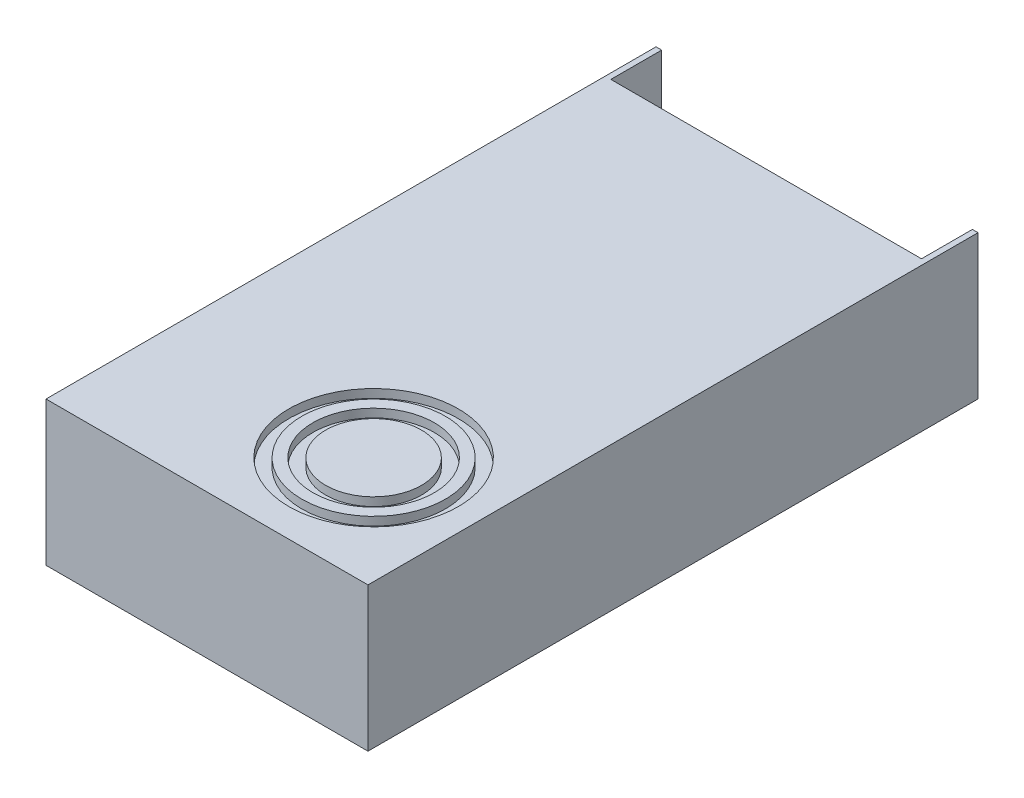
ISO-10303-21;
HEADER;
FILE_DESCRIPTION(('STEP AP214'),'2;1');
FILE_NAME('part.step','',(''),(''),'','','');
FILE_SCHEMA(('AUTOMOTIVE_DESIGN { 1 0 10303 214 1 1 1 1 }'));
ENDSEC;
DATA;
#1=APPLICATION_CONTEXT('core data for automotive mechanical design processes');
#2=APPLICATION_PROTOCOL_DEFINITION('international standard','automotive_design',2000,#1);
#3=PRODUCT_CONTEXT('',#1,'mechanical');
#4=PRODUCT('Part','Part','',(#3));
#5=PRODUCT_RELATED_PRODUCT_CATEGORY('part','',(#4));
#6=PRODUCT_DEFINITION_FORMATION('','',#4);
#7=PRODUCT_DEFINITION_CONTEXT('part definition',#1,'design');
#8=PRODUCT_DEFINITION('design','',#6,#7);
#9=PRODUCT_DEFINITION_SHAPE('','',#8);
#10=(LENGTH_UNIT() NAMED_UNIT(*) SI_UNIT(.MILLI.,.METRE.));
#11=(NAMED_UNIT(*) PLANE_ANGLE_UNIT() SI_UNIT($,.RADIAN.));
#12=(NAMED_UNIT(*) SI_UNIT($,.STERADIAN.) SOLID_ANGLE_UNIT());
#13=UNCERTAINTY_MEASURE_WITH_UNIT(LENGTH_MEASURE(1.E-05),#10,'distance_accuracy_value','');
#14=(GEOMETRIC_REPRESENTATION_CONTEXT(3) GLOBAL_UNCERTAINTY_ASSIGNED_CONTEXT((#13)) GLOBAL_UNIT_ASSIGNED_CONTEXT((#10,
#11,#12)) REPRESENTATION_CONTEXT('',''));
#15=CARTESIAN_POINT('',(0.,0.,0.));
#16=DIRECTION('',(0.,0.,1.));
#17=DIRECTION('',(1.,0.,0.));
#18=AXIS2_PLACEMENT_3D('',#15,#16,#17);
#19=CARTESIAN_POINT('',(-9.40496415424985,8.99999999999999,-27.4856805681259));
#20=DIRECTION('',(0.,0.,1.));
#21=DIRECTION('',(1.,0.,0.));
#22=AXIS2_PLACEMENT_3D('',#19,#20,#21);
#23=PLANE('',#22);
#24=DIRECTION('',(0.,-1.,0.));
#25=VECTOR('',#24,1.);
#26=CARTESIAN_POINT('',(-7.61932535690543,26.,-27.4856805681259));
#27=LINE('',#26,#25);
#28=CARTESIAN_POINT('',(-7.61932535690543,26.,-27.4856805681259));
#29=VERTEX_POINT('',#28);
#30=CARTESIAN_POINT('',(-7.61932535690543,8.99999999999999,-27.4856805681259));
#31=VERTEX_POINT('',#30);
#32=EDGE_CURVE('E137',#29,#31,#27,.T.);
#33=ORIENTED_EDGE('',*,*,#32,.T.);
#34=DIRECTION('',(1.,0.,0.));
#35=VECTOR('',#34,1.);
#36=CARTESIAN_POINT('',(-9.40496415424985,8.99999999999999,-27.4856805681259));
#37=LINE('',#36,#35);
#38=CARTESIAN_POINT('',(-9.40496415424985,8.99999999999999,-27.4856805681259));
#39=VERTEX_POINT('',#38);
#40=EDGE_CURVE('E168',#39,#31,#37,.T.);
#41=ORIENTED_EDGE('',*,*,#40,.F.);
#42=DIRECTION('',(0.,1.,0.));
#43=VECTOR('',#42,1.);
#44=CARTESIAN_POINT('',(-9.40496415424985,8.99999999999999,-27.4856805681259));
#45=LINE('',#44,#43);
#46=CARTESIAN_POINT('',(-9.40496415424985,51.,-27.4856805681259));
#47=VERTEX_POINT('',#46);
#48=EDGE_CURVE('E176',#39,#47,#45,.T.);
#49=ORIENTED_EDGE('',*,*,#48,.T.);
#50=DIRECTION('',(1.,0.,0.));
#51=VECTOR('',#50,1.);
#52=CARTESIAN_POINT('',(-9.40496415424985,51.,-27.4856805681259));
#53=LINE('',#52,#51);
#54=CARTESIAN_POINT('',(100.59503584575,51.,-27.4856805681259));
#55=VERTEX_POINT('',#54);
#56=EDGE_CURVE('E178',#47,#55,#53,.T.);
#57=ORIENTED_EDGE('',*,*,#56,.T.);
#58=DIRECTION('',(0.,1.,0.));
#59=VECTOR('',#58,1.);
#60=CARTESIAN_POINT('',(100.59503584575,8.99999999999999,-27.4856805681259));
#61=LINE('',#60,#59);
#62=CARTESIAN_POINT('',(100.59503584575,8.99999999999999,-27.4856805681259));
#63=VERTEX_POINT('',#62);
#64=EDGE_CURVE('E188',#63,#55,#61,.T.);
#65=ORIENTED_EDGE('',*,*,#64,.F.);
#66=CARTESIAN_POINT('',(79.3806746430946,8.99999999999999,-27.4856805681259));
#67=VERTEX_POINT('',#66);
#68=EDGE_CURVE('E166',#67,#63,#37,.T.);
#69=ORIENTED_EDGE('',*,*,#68,.F.);
#70=DIRECTION('',(0.,-1.,0.));
#71=VECTOR('',#70,1.);
#72=CARTESIAN_POINT('',(79.3806746430946,26.,-27.4856805681259));
#73=LINE('',#72,#71);
#74=CARTESIAN_POINT('',(79.3806746430946,26.,-27.4856805681259));
#75=VERTEX_POINT('',#74);
#76=EDGE_CURVE('E144',#75,#67,#73,.T.);
#77=ORIENTED_EDGE('',*,*,#76,.F.);
#78=DIRECTION('',(1.,0.,0.));
#79=VECTOR('',#78,1.);
#80=CARTESIAN_POINT('',(-7.61932535690543,26.,-27.4856805681259));
#81=LINE('',#80,#79);
#82=EDGE_CURVE('E128',#29,#75,#81,.T.);
#83=ORIENTED_EDGE('',*,*,#82,.F.);
#84=EDGE_LOOP('',(#33,#41,#49,#57,#65,#69,#77,#83));
#85=FACE_BOUND('',#84,.T.);
#86=ADVANCED_FACE('F35',(#85),#23,.F.);
#87=CARTESIAN_POINT('',(0.,8.99999999999999,0.));
#88=DIRECTION('',(0.,1.,0.));
#89=DIRECTION('',(0.,0.,1.));
#90=AXIS2_PLACEMENT_3D('',#87,#88,#89);
#91=PLANE('',#90);
#92=ORIENTED_EDGE('',*,*,#40,.T.);
#93=DIRECTION('',(0.,0.,1.));
#94=VECTOR('',#93,1.);
#95=CARTESIAN_POINT('',(-7.61932535690543,8.99999999999999,-27.4856805681259));
#96=LINE('',#95,#94);
#97=CARTESIAN_POINT('',(-7.61932535690543,8.99999999999999,-43.4856805681259));
#98=VERTEX_POINT('',#97);
#99=EDGE_CURVE('E140',#98,#31,#96,.T.);
#100=ORIENTED_EDGE('',*,*,#99,.F.);
#101=DIRECTION('',(-1.,0.,0.));
#102=VECTOR('',#101,1.);
#103=CARTESIAN_POINT('',(-7.61932535690543,8.99999999999999,-43.4856805681259));
#104=LINE('',#103,#102);
#105=CARTESIAN_POINT('',(79.3806746430946,8.99999999999999,-43.4856805681259));
#106=VERTEX_POINT('',#105);
#107=EDGE_CURVE('E134',#106,#98,#104,.T.);
#108=ORIENTED_EDGE('',*,*,#107,.F.);
#109=DIRECTION('',(0.,0.,-1.));
#110=VECTOR('',#109,1.);
#111=CARTESIAN_POINT('',(79.3806746430946,8.99999999999999,-27.4856805681259));
#112=LINE('',#111,#110);
#113=EDGE_CURVE('E156',#67,#106,#112,.T.);
#114=ORIENTED_EDGE('',*,*,#113,.F.);
#115=ORIENTED_EDGE('',*,*,#68,.T.);
#116=DIRECTION('',(0.,0.,-1.));
#117=VECTOR('',#116,1.);
#118=CARTESIAN_POINT('',(100.59503584575,8.99999999999999,-45.4856805681259));
#119=LINE('',#118,#117);
#120=CARTESIAN_POINT('',(100.59503584575,8.99999999999999,-45.4856805681259));
#121=VERTEX_POINT('',#120);
#122=EDGE_CURVE('E170',#63,#121,#119,.T.);
#123=ORIENTED_EDGE('',*,*,#122,.T.);
#124=DIRECTION('',(-1.,0.,0.));
#125=VECTOR('',#124,1.);
#126=CARTESIAN_POINT('',(-9.40496415424985,8.99999999999999,-45.4856805681259));
#127=LINE('',#126,#125);
#128=CARTESIAN_POINT('',(-9.40496415424985,8.99999999999999,-45.4856805681259));
#129=VERTEX_POINT('',#128);
#130=EDGE_CURVE('E173',#121,#129,#127,.T.);
#131=ORIENTED_EDGE('',*,*,#130,.T.);
#132=DIRECTION('',(0.,0.,1.));
#133=VECTOR('',#132,1.);
#134=CARTESIAN_POINT('',(-9.40496415424985,8.99999999999999,-45.4856805681259));
#135=LINE('',#134,#133);
#136=EDGE_CURVE('E163',#129,#39,#135,.T.);
#137=ORIENTED_EDGE('',*,*,#136,.T.);
#138=EDGE_LOOP('',(#92,#100,#108,#114,#115,#123,#131,#137));
#139=FACE_BOUND('',#138,.T.);
#140=ADVANCED_FACE('F290',(#139),#91,.T.);
#141=CARTESIAN_POINT('',(-11.4049641542499,51.,-45.4856805681259));
#142=DIRECTION('',(1.,0.,0.));
#143=DIRECTION('',(0.,0.,-1.));
#144=AXIS2_PLACEMENT_3D('',#141,#142,#143);
#145=PLANE('',#144);
#146=DIRECTION('',(0.,0.,1.));
#147=VECTOR('',#146,1.);
#148=CARTESIAN_POINT('',(-11.4049641542499,0.,-45.4856805681259));
#149=LINE('',#148,#147);
#150=CARTESIAN_POINT('',(-11.4049641542499,0.,-45.4856805681259));
#151=VERTEX_POINT('',#150);
#152=CARTESIAN_POINT('',(-11.4049641542498,0.,170.514319431874));
#153=VERTEX_POINT('',#152);
#154=EDGE_CURVE('E236',#151,#153,#149,.T.);
#155=ORIENTED_EDGE('',*,*,#154,.T.);
#156=DIRECTION('',(0.,-1.,0.));
#157=VECTOR('',#156,1.);
#158=CARTESIAN_POINT('',(-11.4049641542498,51.,170.514319431874));
#159=LINE('',#158,#157);
#160=CARTESIAN_POINT('',(-11.4049641542498,51.,170.514319431874));
#161=VERTEX_POINT('',#160);
#162=EDGE_CURVE('E11',#161,#153,#159,.T.);
#163=ORIENTED_EDGE('',*,*,#162,.F.);
#164=DIRECTION('',(0.,0.,1.));
#165=VECTOR('',#164,1.);
#166=CARTESIAN_POINT('',(-11.4049641542499,51.,-45.4856805681259));
#167=LINE('',#166,#165);
#168=CARTESIAN_POINT('',(-11.4049641542499,51.,-45.4856805681259));
#169=VERTEX_POINT('',#168);
#170=EDGE_CURVE('E239',#169,#161,#167,.T.);
#171=ORIENTED_EDGE('',*,*,#170,.F.);
#172=DIRECTION('',(0.,-1.,0.));
#173=VECTOR('',#172,1.);
#174=CARTESIAN_POINT('',(-11.4049641542499,51.,-45.4856805681259));
#175=LINE('',#174,#173);
#176=EDGE_CURVE('E251',#169,#151,#175,.T.);
#177=ORIENTED_EDGE('',*,*,#176,.T.);
#178=EDGE_LOOP('',(#155,#163,#171,#177));
#179=FACE_BOUND('',#178,.T.);
#180=ADVANCED_FACE('F37',(#179),#145,.F.);
#181=CARTESIAN_POINT('',(-11.4049641542498,51.,170.514319431874));
#182=DIRECTION('',(0.,0.,-1.));
#183=DIRECTION('',(-1.,0.,0.));
#184=AXIS2_PLACEMENT_3D('',#181,#182,#183);
#185=PLANE('',#184);
#186=DIRECTION('',(1.,0.,0.));
#187=VECTOR('',#186,1.);
#188=CARTESIAN_POINT('',(-11.4049641542498,0.,170.514319431874));
#189=LINE('',#188,#187);
#190=CARTESIAN_POINT('',(102.59503584575,0.,170.514319431874));
#191=VERTEX_POINT('',#190);
#192=EDGE_CURVE('E254',#153,#191,#189,.T.);
#193=ORIENTED_EDGE('',*,*,#192,.T.);
#194=DIRECTION('',(0.,-1.,0.));
#195=VECTOR('',#194,1.);
#196=CARTESIAN_POINT('',(102.59503584575,51.,170.514319431874));
#197=LINE('',#196,#195);
#198=CARTESIAN_POINT('',(102.59503584575,51.,170.514319431874));
#199=VERTEX_POINT('',#198);
#200=EDGE_CURVE('E43',#199,#191,#197,.T.);
#201=ORIENTED_EDGE('',*,*,#200,.F.);
#202=DIRECTION('',(1.,0.,0.));
#203=VECTOR('',#202,1.);
#204=CARTESIAN_POINT('',(-11.4049641542498,51.,170.514319431874));
#205=LINE('',#204,#203);
#206=EDGE_CURVE('E242',#161,#199,#205,.T.);
#207=ORIENTED_EDGE('',*,*,#206,.F.);
#208=ORIENTED_EDGE('',*,*,#162,.T.);
#209=EDGE_LOOP('',(#193,#201,#207,#208));
#210=FACE_BOUND('',#209,.T.);
#211=ADVANCED_FACE('F395',(#210),#185,.F.);
#212=CARTESIAN_POINT('',(102.59503584575,51.,-45.4856805681259));
#213=DIRECTION('',(-1.,0.,0.));
#214=DIRECTION('',(0.,0.,1.));
#215=AXIS2_PLACEMENT_3D('',#212,#213,#214);
#216=PLANE('',#215);
#217=DIRECTION('',(0.,0.,-1.));
#218=VECTOR('',#217,1.);
#219=CARTESIAN_POINT('',(102.59503584575,0.,-45.4856805681259));
#220=LINE('',#219,#218);
#221=CARTESIAN_POINT('',(102.59503584575,0.,-45.4856805681259));
#222=VERTEX_POINT('',#221);
#223=EDGE_CURVE('E256',#191,#222,#220,.T.);
#224=ORIENTED_EDGE('',*,*,#223,.T.);
#225=DIRECTION('',(0.,-1.,0.));
#226=VECTOR('',#225,1.);
#227=CARTESIAN_POINT('',(102.59503584575,51.,-45.4856805681259));
#228=LINE('',#227,#226);
#229=CARTESIAN_POINT('',(102.59503584575,51.,-45.4856805681259));
#230=VERTEX_POINT('',#229);
#231=EDGE_CURVE('E261',#230,#222,#228,.T.);
#232=ORIENTED_EDGE('',*,*,#231,.F.);
#233=DIRECTION('',(0.,0.,-1.));
#234=VECTOR('',#233,1.);
#235=CARTESIAN_POINT('',(102.59503584575,51.,-45.4856805681259));
#236=LINE('',#235,#234);
#237=EDGE_CURVE('E245',#199,#230,#236,.T.);
#238=ORIENTED_EDGE('',*,*,#237,.F.);
#239=ORIENTED_EDGE('',*,*,#200,.T.);
#240=EDGE_LOOP('',(#224,#232,#238,#239));
#241=FACE_BOUND('',#240,.T.);
#242=ADVANCED_FACE('F268',(#241),#216,.F.);
#243=CARTESIAN_POINT('',(-11.4049641542499,51.,-45.4856805681259));
#244=DIRECTION('',(0.,0.,1.));
#245=DIRECTION('',(1.,0.,0.));
#246=AXIS2_PLACEMENT_3D('',#243,#244,#245);
#247=PLANE('',#246);
#248=DIRECTION('',(-1.,0.,0.));
#249=VECTOR('',#248,1.);
#250=CARTESIAN_POINT('',(-11.4049641542499,51.,-45.4856805681259));
#251=LINE('',#250,#249);
#252=CARTESIAN_POINT('',(-9.40496415424985,51.,-45.4856805681259));
#253=VERTEX_POINT('',#252);
#254=EDGE_CURVE('E247',#253,#169,#251,.T.);
#255=ORIENTED_EDGE('',*,*,#254,.F.);
#256=DIRECTION('',(0.,1.,0.));
#257=VECTOR('',#256,1.);
#258=CARTESIAN_POINT('',(-9.40496415424985,8.99999999999999,-45.4856805681259));
#259=LINE('',#258,#257);
#260=EDGE_CURVE('E182',#129,#253,#259,.T.);
#261=ORIENTED_EDGE('',*,*,#260,.F.);
#262=ORIENTED_EDGE('',*,*,#130,.F.);
#263=DIRECTION('',(0.,1.,0.));
#264=VECTOR('',#263,1.);
#265=CARTESIAN_POINT('',(100.59503584575,8.99999999999999,-45.4856805681259));
#266=LINE('',#265,#264);
#267=CARTESIAN_POINT('',(100.59503584575,51.,-45.4856805681259));
#268=VERTEX_POINT('',#267);
#269=EDGE_CURVE('E185',#121,#268,#266,.T.);
#270=ORIENTED_EDGE('',*,*,#269,.T.);
#271=EDGE_CURVE('E248',#230,#268,#251,.T.);
#272=ORIENTED_EDGE('',*,*,#271,.F.);
#273=ORIENTED_EDGE('',*,*,#231,.T.);
#274=DIRECTION('',(-1.,0.,0.));
#275=VECTOR('',#274,1.);
#276=CARTESIAN_POINT('',(-11.4049641542499,0.,-45.4856805681259));
#277=LINE('',#276,#275);
#278=EDGE_CURVE('E243',#222,#151,#277,.T.);
#279=ORIENTED_EDGE('',*,*,#278,.T.);
#280=ORIENTED_EDGE('',*,*,#176,.F.);
#281=EDGE_LOOP('',(#255,#261,#262,#270,#272,#273,#279,#280));
#282=FACE_BOUND('',#281,.T.);
#283=ADVANCED_FACE('F278',(#282),#247,.F.);
#284=CARTESIAN_POINT('',(0.,51.,0.));
#285=DIRECTION('',(0.,1.,0.));
#286=DIRECTION('',(0.,0.,1.));
#287=AXIS2_PLACEMENT_3D('',#284,#285,#286);
#288=PLANE('',#287);
#289=CARTESIAN_POINT('',(64.5950358457502,51.,130.514319431874));
#290=DIRECTION('',(0.,1.,0.));
#291=DIRECTION('',(0.,0.,1.));
#292=AXIS2_PLACEMENT_3D('',#289,#290,#291);
#293=CIRCLE('',#292,30.);
#294=CARTESIAN_POINT('',(64.5950358457502,51.,160.514319431874));
#295=VERTEX_POINT('',#294);
#296=EDGE_CURVE('E545',#295,#295,#293,.T.);
#297=ORIENTED_EDGE('',*,*,#296,.F.);
#298=EDGE_LOOP('',(#297));
#299=FACE_BOUND('',#298,.T.);
#300=DIRECTION('',(0.,0.,1.));
#301=VECTOR('',#300,1.);
#302=CARTESIAN_POINT('',(-9.40496415424985,51.,-45.4856805681259));
#303=LINE('',#302,#301);
#304=EDGE_CURVE('E58',#253,#47,#303,.T.);
#305=ORIENTED_EDGE('',*,*,#304,.F.);
#306=ORIENTED_EDGE('',*,*,#254,.T.);
#307=ORIENTED_EDGE('',*,*,#170,.T.);
#308=ORIENTED_EDGE('',*,*,#206,.T.);
#309=ORIENTED_EDGE('',*,*,#237,.T.);
#310=ORIENTED_EDGE('',*,*,#271,.T.);
#311=DIRECTION('',(0.,0.,-1.));
#312=VECTOR('',#311,1.);
#313=CARTESIAN_POINT('',(100.59503584575,51.,-45.4856805681259));
#314=LINE('',#313,#312);
#315=EDGE_CURVE('E167',#55,#268,#314,.T.);
#316=ORIENTED_EDGE('',*,*,#315,.F.);
#317=ORIENTED_EDGE('',*,*,#56,.F.);
#318=EDGE_LOOP('',(#305,#306,#307,#308,#309,#310,#316,#317));
#319=FACE_BOUND('',#318,.T.);
#320=ADVANCED_FACE('F284',(#299,#319),#288,.T.);
#321=CARTESIAN_POINT('',(0.,0.,0.));
#322=DIRECTION('',(0.,1.,0.));
#323=DIRECTION('',(0.,0.,1.));
#324=AXIS2_PLACEMENT_3D('',#321,#322,#323);
#325=PLANE('',#324);
#326=CARTESIAN_POINT('',(70.5950358457501,0.,-12.4856805681259));
#327=DIRECTION('',(0.,-1.,0.));
#328=DIRECTION('',(0.,0.,-1.));
#329=AXIS2_PLACEMENT_3D('',#326,#327,#328);
#330=CIRCLE('',#329,2.);
#331=CARTESIAN_POINT('',(70.5950358457501,0.,-14.4856805681259));
#332=VERTEX_POINT('',#331);
#333=EDGE_CURVE('E184',#332,#332,#330,.T.);
#334=ORIENTED_EDGE('',*,*,#333,.F.);
#335=EDGE_LOOP('',(#334));
#336=FACE_BOUND('',#335,.T.);
#337=CARTESIAN_POINT('',(20.5950358457501,0.,-12.4856805681259));
#338=DIRECTION('',(0.,-1.,0.));
#339=DIRECTION('',(0.,0.,-1.));
#340=AXIS2_PLACEMENT_3D('',#337,#338,#339);
#341=CIRCLE('',#340,2.);
#342=CARTESIAN_POINT('',(20.5950358457501,0.,-14.4856805681259));
#343=VERTEX_POINT('',#342);
#344=EDGE_CURVE('E194',#343,#343,#341,.T.);
#345=ORIENTED_EDGE('',*,*,#344,.F.);
#346=EDGE_LOOP('',(#345));
#347=FACE_BOUND('',#346,.T.);
#348=CARTESIAN_POINT('',(70.5950358457501,0.,137.514319431874));
#349=DIRECTION('',(0.,-1.,0.));
#350=DIRECTION('',(0.,0.,-1.));
#351=AXIS2_PLACEMENT_3D('',#348,#349,#350);
#352=CIRCLE('',#351,2.);
#353=CARTESIAN_POINT('',(70.5950358457501,0.,135.514319431874));
#354=VERTEX_POINT('',#353);
#355=EDGE_CURVE('E200',#354,#354,#352,.T.);
#356=ORIENTED_EDGE('',*,*,#355,.F.);
#357=EDGE_LOOP('',(#356));
#358=FACE_BOUND('',#357,.T.);
#359=CARTESIAN_POINT('',(20.5950358457501,0.,137.514319431874));
#360=DIRECTION('',(0.,-1.,0.));
#361=DIRECTION('',(0.,0.,-1.));
#362=AXIS2_PLACEMENT_3D('',#359,#360,#361);
#363=CIRCLE('',#362,2.);
#364=CARTESIAN_POINT('',(20.5950358457501,0.,135.514319431874));
#365=VERTEX_POINT('',#364);
#366=EDGE_CURVE('E206',#365,#365,#363,.T.);
#367=ORIENTED_EDGE('',*,*,#366,.F.);
#368=EDGE_LOOP('',(#367));
#369=FACE_BOUND('',#368,.T.);
#370=CARTESIAN_POINT('',(93.0950358457501,0.,-16.4856805681259));
#371=DIRECTION('',(0.,-1.,0.));
#372=DIRECTION('',(0.,0.,-1.));
#373=AXIS2_PLACEMENT_3D('',#370,#371,#372);
#374=CIRCLE('',#373,1.5);
#375=CARTESIAN_POINT('',(93.0950358457501,0.,-17.9856805681259));
#376=VERTEX_POINT('',#375);
#377=EDGE_CURVE('E212',#376,#376,#374,.T.);
#378=ORIENTED_EDGE('',*,*,#377,.F.);
#379=EDGE_LOOP('',(#378));
#380=FACE_BOUND('',#379,.T.);
#381=CARTESIAN_POINT('',(-1.90496415424986,0.,-16.4856805681259));
#382=DIRECTION('',(0.,-1.,0.));
#383=DIRECTION('',(0.,0.,-1.));
#384=AXIS2_PLACEMENT_3D('',#381,#382,#383);
#385=CIRCLE('',#384,1.5);
#386=CARTESIAN_POINT('',(-1.90496415424986,0.,-17.9856805681259));
#387=VERTEX_POINT('',#386);
#388=EDGE_CURVE('E218',#387,#387,#385,.T.);
#389=ORIENTED_EDGE('',*,*,#388,.F.);
#390=EDGE_LOOP('',(#389));
#391=FACE_BOUND('',#390,.T.);
#392=CARTESIAN_POINT('',(93.0950358457501,0.,160.514319431874));
#393=DIRECTION('',(0.,-1.,0.));
#394=DIRECTION('',(0.,0.,-1.));
#395=AXIS2_PLACEMENT_3D('',#392,#393,#394);
#396=CIRCLE('',#395,1.5);
#397=CARTESIAN_POINT('',(93.0950358457501,0.,159.014319431874));
#398=VERTEX_POINT('',#397);
#399=EDGE_CURVE('E224',#398,#398,#396,.T.);
#400=ORIENTED_EDGE('',*,*,#399,.F.);
#401=EDGE_LOOP('',(#400));
#402=FACE_BOUND('',#401,.T.);
#403=CARTESIAN_POINT('',(-1.90496415424989,0.,160.514319431874));
#404=DIRECTION('',(0.,-1.,0.));
#405=DIRECTION('',(0.,0.,-1.));
#406=AXIS2_PLACEMENT_3D('',#403,#404,#405);
#407=CIRCLE('',#406,1.5);
#408=CARTESIAN_POINT('',(-1.90496415424989,0.,159.014319431874));
#409=VERTEX_POINT('',#408);
#410=EDGE_CURVE('E230',#409,#409,#407,.T.);
#411=ORIENTED_EDGE('',*,*,#410,.F.);
#412=EDGE_LOOP('',(#411));
#413=FACE_BOUND('',#412,.T.);
#414=ORIENTED_EDGE('',*,*,#154,.F.);
#415=ORIENTED_EDGE('',*,*,#278,.F.);
#416=ORIENTED_EDGE('',*,*,#223,.F.);
#417=ORIENTED_EDGE('',*,*,#192,.F.);
#418=EDGE_LOOP('',(#414,#415,#416,#417));
#419=FACE_BOUND('',#418,.T.);
#420=ADVANCED_FACE('F274',(#336,#347,#358,#369,#380,#391,#402,#413,#419),#325,.F.);
#421=CARTESIAN_POINT('',(-1.90496415424989,10.,160.514319431874));
#422=DIRECTION('',(0.,-1.,0.));
#423=DIRECTION('',(0.,0.,-1.));
#424=AXIS2_PLACEMENT_3D('',#421,#422,#423);
#425=CYLINDRICAL_SURFACE('',#424,1.5);
#426=CARTESIAN_POINT('',(-1.90496415424989,10.,160.514319431874));
#427=DIRECTION('',(0.,-1.,0.));
#428=DIRECTION('',(0.,0.,-1.));
#429=AXIS2_PLACEMENT_3D('',#426,#427,#428);
#430=CIRCLE('',#429,1.5);
#431=CARTESIAN_POINT('',(-1.90496415424989,10.,159.014319431874));
#432=VERTEX_POINT('',#431);
#433=EDGE_CURVE('E233',#432,#432,#430,.T.);
#434=ORIENTED_EDGE('',*,*,#433,.F.);
#435=EDGE_LOOP('',(#434));
#436=FACE_BOUND('',#435,.T.);
#437=ORIENTED_EDGE('',*,*,#410,.T.);
#438=EDGE_LOOP('',(#437));
#439=FACE_BOUND('',#438,.T.);
#440=ADVANCED_FACE('F379',(#436,#439),#425,.F.);
#441=CARTESIAN_POINT('',(-1.90496415424989,10.,160.514319431874));
#442=DIRECTION('',(0.,-1.,0.));
#443=DIRECTION('',(0.,0.,-1.));
#444=AXIS2_PLACEMENT_3D('',#441,#442,#443);
#445=PLANE('',#444);
#446=ORIENTED_EDGE('',*,*,#433,.T.);
#447=EDGE_LOOP('',(#446));
#448=FACE_BOUND('',#447,.T.);
#449=ADVANCED_FACE('F375',(#448),#445,.T.);
#450=CARTESIAN_POINT('',(93.0950358457501,10.,160.514319431874));
#451=DIRECTION('',(0.,-1.,0.));
#452=DIRECTION('',(0.,0.,-1.));
#453=AXIS2_PLACEMENT_3D('',#450,#451,#452);
#454=CYLINDRICAL_SURFACE('',#453,1.5);
#455=CARTESIAN_POINT('',(93.0950358457501,10.,160.514319431874));
#456=DIRECTION('',(0.,-1.,0.));
#457=DIRECTION('',(0.,0.,-1.));
#458=AXIS2_PLACEMENT_3D('',#455,#456,#457);
#459=CIRCLE('',#458,1.5);
#460=CARTESIAN_POINT('',(93.0950358457501,10.,159.014319431874));
#461=VERTEX_POINT('',#460);
#462=EDGE_CURVE('E227',#461,#461,#459,.T.);
#463=ORIENTED_EDGE('',*,*,#462,.F.);
#464=EDGE_LOOP('',(#463));
#465=FACE_BOUND('',#464,.T.);
#466=ORIENTED_EDGE('',*,*,#399,.T.);
#467=EDGE_LOOP('',(#466));
#468=FACE_BOUND('',#467,.T.);
#469=ADVANCED_FACE('F371',(#465,#468),#454,.F.);
#470=CARTESIAN_POINT('',(93.0950358457501,10.,160.514319431874));
#471=DIRECTION('',(0.,-1.,0.));
#472=DIRECTION('',(0.,0.,-1.));
#473=AXIS2_PLACEMENT_3D('',#470,#471,#472);
#474=PLANE('',#473);
#475=ORIENTED_EDGE('',*,*,#462,.T.);
#476=EDGE_LOOP('',(#475));
#477=FACE_BOUND('',#476,.T.);
#478=ADVANCED_FACE('F367',(#477),#474,.T.);
#479=CARTESIAN_POINT('',(-1.90496415424986,10.,-16.4856805681259));
#480=DIRECTION('',(0.,-1.,0.));
#481=DIRECTION('',(0.,0.,-1.));
#482=AXIS2_PLACEMENT_3D('',#479,#480,#481);
#483=CYLINDRICAL_SURFACE('',#482,1.5);
#484=CARTESIAN_POINT('',(-1.90496415424986,10.,-16.4856805681259));
#485=DIRECTION('',(0.,-1.,0.));
#486=DIRECTION('',(0.,0.,-1.));
#487=AXIS2_PLACEMENT_3D('',#484,#485,#486);
#488=CIRCLE('',#487,1.5);
#489=CARTESIAN_POINT('',(-1.90496415424986,10.,-17.9856805681259));
#490=VERTEX_POINT('',#489);
#491=EDGE_CURVE('E221',#490,#490,#488,.T.);
#492=ORIENTED_EDGE('',*,*,#491,.F.);
#493=EDGE_LOOP('',(#492));
#494=FACE_BOUND('',#493,.T.);
#495=ORIENTED_EDGE('',*,*,#388,.T.);
#496=EDGE_LOOP('',(#495));
#497=FACE_BOUND('',#496,.T.);
#498=ADVANCED_FACE('F363',(#494,#497),#483,.F.);
#499=CARTESIAN_POINT('',(-1.90496415424986,10.,-16.4856805681259));
#500=DIRECTION('',(0.,-1.,0.));
#501=DIRECTION('',(0.,0.,-1.));
#502=AXIS2_PLACEMENT_3D('',#499,#500,#501);
#503=PLANE('',#502);
#504=ORIENTED_EDGE('',*,*,#491,.T.);
#505=EDGE_LOOP('',(#504));
#506=FACE_BOUND('',#505,.T.);
#507=ADVANCED_FACE('F359',(#506),#503,.T.);
#508=CARTESIAN_POINT('',(93.0950358457501,10.,-16.4856805681259));
#509=DIRECTION('',(0.,-1.,0.));
#510=DIRECTION('',(0.,0.,-1.));
#511=AXIS2_PLACEMENT_3D('',#508,#509,#510);
#512=CYLINDRICAL_SURFACE('',#511,1.5);
#513=CARTESIAN_POINT('',(93.0950358457501,10.,-16.4856805681259));
#514=DIRECTION('',(0.,-1.,0.));
#515=DIRECTION('',(0.,0.,-1.));
#516=AXIS2_PLACEMENT_3D('',#513,#514,#515);
#517=CIRCLE('',#516,1.5);
#518=CARTESIAN_POINT('',(93.0950358457501,10.,-17.9856805681259));
#519=VERTEX_POINT('',#518);
#520=EDGE_CURVE('E215',#519,#519,#517,.T.);
#521=ORIENTED_EDGE('',*,*,#520,.F.);
#522=EDGE_LOOP('',(#521));
#523=FACE_BOUND('',#522,.T.);
#524=ORIENTED_EDGE('',*,*,#377,.T.);
#525=EDGE_LOOP('',(#524));
#526=FACE_BOUND('',#525,.T.);
#527=ADVANCED_FACE('F355',(#523,#526),#512,.F.);
#528=CARTESIAN_POINT('',(93.0950358457501,10.,-16.4856805681259));
#529=DIRECTION('',(0.,-1.,0.));
#530=DIRECTION('',(0.,0.,-1.));
#531=AXIS2_PLACEMENT_3D('',#528,#529,#530);
#532=PLANE('',#531);
#533=ORIENTED_EDGE('',*,*,#520,.T.);
#534=EDGE_LOOP('',(#533));
#535=FACE_BOUND('',#534,.T.);
#536=ADVANCED_FACE('F351',(#535),#532,.T.);
#537=CARTESIAN_POINT('',(20.5950358457501,10.,137.514319431874));
#538=DIRECTION('',(0.,-1.,0.));
#539=DIRECTION('',(0.,0.,-1.));
#540=AXIS2_PLACEMENT_3D('',#537,#538,#539);
#541=CYLINDRICAL_SURFACE('',#540,2.);
#542=CARTESIAN_POINT('',(20.5950358457501,10.,137.514319431874));
#543=DIRECTION('',(0.,-1.,0.));
#544=DIRECTION('',(0.,0.,-1.));
#545=AXIS2_PLACEMENT_3D('',#542,#543,#544);
#546=CIRCLE('',#545,2.);
#547=CARTESIAN_POINT('',(20.5950358457501,10.,135.514319431874));
#548=VERTEX_POINT('',#547);
#549=EDGE_CURVE('E209',#548,#548,#546,.T.);
#550=ORIENTED_EDGE('',*,*,#549,.F.);
#551=EDGE_LOOP('',(#550));
#552=FACE_BOUND('',#551,.T.);
#553=ORIENTED_EDGE('',*,*,#366,.T.);
#554=EDGE_LOOP('',(#553));
#555=FACE_BOUND('',#554,.T.);
#556=ADVANCED_FACE('F347',(#552,#555),#541,.F.);
#557=CARTESIAN_POINT('',(20.5950358457501,10.,137.514319431874));
#558=DIRECTION('',(0.,-1.,0.));
#559=DIRECTION('',(0.,0.,-1.));
#560=AXIS2_PLACEMENT_3D('',#557,#558,#559);
#561=PLANE('',#560);
#562=ORIENTED_EDGE('',*,*,#549,.T.);
#563=EDGE_LOOP('',(#562));
#564=FACE_BOUND('',#563,.T.);
#565=ADVANCED_FACE('F343',(#564),#561,.T.);
#566=CARTESIAN_POINT('',(70.5950358457501,10.,137.514319431874));
#567=DIRECTION('',(0.,-1.,0.));
#568=DIRECTION('',(0.,0.,-1.));
#569=AXIS2_PLACEMENT_3D('',#566,#567,#568);
#570=CYLINDRICAL_SURFACE('',#569,2.);
#571=CARTESIAN_POINT('',(70.5950358457501,10.,137.514319431874));
#572=DIRECTION('',(0.,-1.,0.));
#573=DIRECTION('',(0.,0.,-1.));
#574=AXIS2_PLACEMENT_3D('',#571,#572,#573);
#575=CIRCLE('',#574,2.);
#576=CARTESIAN_POINT('',(70.5950358457501,10.,135.514319431874));
#577=VERTEX_POINT('',#576);
#578=EDGE_CURVE('E203',#577,#577,#575,.T.);
#579=ORIENTED_EDGE('',*,*,#578,.F.);
#580=EDGE_LOOP('',(#579));
#581=FACE_BOUND('',#580,.T.);
#582=ORIENTED_EDGE('',*,*,#355,.T.);
#583=EDGE_LOOP('',(#582));
#584=FACE_BOUND('',#583,.T.);
#585=ADVANCED_FACE('F339',(#581,#584),#570,.F.);
#586=CARTESIAN_POINT('',(70.5950358457501,10.,137.514319431874));
#587=DIRECTION('',(0.,-1.,0.));
#588=DIRECTION('',(0.,0.,-1.));
#589=AXIS2_PLACEMENT_3D('',#586,#587,#588);
#590=PLANE('',#589);
#591=ORIENTED_EDGE('',*,*,#578,.T.);
#592=EDGE_LOOP('',(#591));
#593=FACE_BOUND('',#592,.T.);
#594=ADVANCED_FACE('F335',(#593),#590,.T.);
#595=CARTESIAN_POINT('',(20.5950358457501,10.,-12.4856805681259));
#596=DIRECTION('',(0.,-1.,0.));
#597=DIRECTION('',(0.,0.,-1.));
#598=AXIS2_PLACEMENT_3D('',#595,#596,#597);
#599=CYLINDRICAL_SURFACE('',#598,2.);
#600=CARTESIAN_POINT('',(20.5950358457501,10.,-12.4856805681259));
#601=DIRECTION('',(0.,-1.,0.));
#602=DIRECTION('',(0.,0.,-1.));
#603=AXIS2_PLACEMENT_3D('',#600,#601,#602);
#604=CIRCLE('',#603,2.);
#605=CARTESIAN_POINT('',(20.5950358457501,10.,-14.4856805681259));
#606=VERTEX_POINT('',#605);
#607=EDGE_CURVE('E197',#606,#606,#604,.T.);
#608=ORIENTED_EDGE('',*,*,#607,.F.);
#609=EDGE_LOOP('',(#608));
#610=FACE_BOUND('',#609,.T.);
#611=ORIENTED_EDGE('',*,*,#344,.T.);
#612=EDGE_LOOP('',(#611));
#613=FACE_BOUND('',#612,.T.);
#614=ADVANCED_FACE('F331',(#610,#613),#599,.F.);
#615=CARTESIAN_POINT('',(20.5950358457501,10.,-12.4856805681259));
#616=DIRECTION('',(0.,-1.,0.));
#617=DIRECTION('',(0.,0.,-1.));
#618=AXIS2_PLACEMENT_3D('',#615,#616,#617);
#619=PLANE('',#618);
#620=ORIENTED_EDGE('',*,*,#607,.T.);
#621=EDGE_LOOP('',(#620));
#622=FACE_BOUND('',#621,.T.);
#623=ADVANCED_FACE('F327',(#622),#619,.T.);
#624=CARTESIAN_POINT('',(70.5950358457501,10.,-12.4856805681259));
#625=DIRECTION('',(0.,-1.,0.));
#626=DIRECTION('',(0.,0.,-1.));
#627=AXIS2_PLACEMENT_3D('',#624,#625,#626);
#628=CYLINDRICAL_SURFACE('',#627,2.);
#629=CARTESIAN_POINT('',(70.5950358457501,10.,-12.4856805681259));
#630=DIRECTION('',(0.,-1.,0.));
#631=DIRECTION('',(0.,0.,-1.));
#632=AXIS2_PLACEMENT_3D('',#629,#630,#631);
#633=CIRCLE('',#632,2.);
#634=CARTESIAN_POINT('',(70.5950358457501,10.,-14.4856805681259));
#635=VERTEX_POINT('',#634);
#636=EDGE_CURVE('E191',#635,#635,#633,.T.);
#637=ORIENTED_EDGE('',*,*,#636,.F.);
#638=EDGE_LOOP('',(#637));
#639=FACE_BOUND('',#638,.T.);
#640=ORIENTED_EDGE('',*,*,#333,.T.);
#641=EDGE_LOOP('',(#640));
#642=FACE_BOUND('',#641,.T.);
#643=ADVANCED_FACE('F323',(#639,#642),#628,.F.);
#644=CARTESIAN_POINT('',(70.5950358457501,10.,-12.4856805681259));
#645=DIRECTION('',(0.,-1.,0.));
#646=DIRECTION('',(0.,0.,-1.));
#647=AXIS2_PLACEMENT_3D('',#644,#645,#646);
#648=PLANE('',#647);
#649=ORIENTED_EDGE('',*,*,#636,.T.);
#650=EDGE_LOOP('',(#649));
#651=FACE_BOUND('',#650,.T.);
#652=ADVANCED_FACE('F320',(#651),#648,.T.);
#653=CARTESIAN_POINT('',(-9.40496415424985,8.99999999999999,-45.4856805681259));
#654=DIRECTION('',(-1.,0.,0.));
#655=DIRECTION('',(0.,0.,1.));
#656=AXIS2_PLACEMENT_3D('',#653,#654,#655);
#657=PLANE('',#656);
#658=ORIENTED_EDGE('',*,*,#304,.T.);
#659=ORIENTED_EDGE('',*,*,#48,.F.);
#660=ORIENTED_EDGE('',*,*,#136,.F.);
#661=ORIENTED_EDGE('',*,*,#260,.T.);
#662=EDGE_LOOP('',(#658,#659,#660,#661));
#663=FACE_BOUND('',#662,.T.);
#664=ADVANCED_FACE('F288',(#663),#657,.F.);
#665=CARTESIAN_POINT('',(100.59503584575,8.99999999999999,-45.4856805681259));
#666=DIRECTION('',(1.,0.,0.));
#667=DIRECTION('',(0.,0.,-1.));
#668=AXIS2_PLACEMENT_3D('',#665,#666,#667);
#669=PLANE('',#668);
#670=ORIENTED_EDGE('',*,*,#315,.T.);
#671=ORIENTED_EDGE('',*,*,#269,.F.);
#672=ORIENTED_EDGE('',*,*,#122,.F.);
#673=ORIENTED_EDGE('',*,*,#64,.T.);
#674=EDGE_LOOP('',(#670,#671,#672,#673));
#675=FACE_BOUND('',#674,.T.);
#676=ADVANCED_FACE('F295',(#675),#669,.F.);
#677=CARTESIAN_POINT('',(-7.61932535690543,26.,-27.4856805681259));
#678=DIRECTION('',(1.,0.,0.));
#679=DIRECTION('',(0.,0.,-1.));
#680=AXIS2_PLACEMENT_3D('',#677,#678,#679);
#681=PLANE('',#680);
#682=ORIENTED_EDGE('',*,*,#99,.T.);
#683=ORIENTED_EDGE('',*,*,#32,.F.);
#684=DIRECTION('',(0.,0.,1.));
#685=VECTOR('',#684,1.);
#686=CARTESIAN_POINT('',(-7.61932535690543,26.,-27.4856805681259));
#687=LINE('',#686,#685);
#688=CARTESIAN_POINT('',(-7.61932535690543,26.,-43.4856805681259));
#689=VERTEX_POINT('',#688);
#690=EDGE_CURVE('E124',#689,#29,#687,.T.);
#691=ORIENTED_EDGE('',*,*,#690,.F.);
#692=DIRECTION('',(0.,-1.,0.));
#693=VECTOR('',#692,1.);
#694=CARTESIAN_POINT('',(-7.61932535690543,26.,-43.4856805681259));
#695=LINE('',#694,#693);
#696=EDGE_CURVE('E154',#689,#98,#695,.T.);
#697=ORIENTED_EDGE('',*,*,#696,.T.);
#698=EDGE_LOOP('',(#682,#683,#691,#697));
#699=FACE_BOUND('',#698,.T.);
#700=ADVANCED_FACE('F138',(#699),#681,.F.);
#701=CARTESIAN_POINT('',(79.3806746430946,26.,-27.4856805681259));
#702=DIRECTION('',(-1.,0.,0.));
#703=DIRECTION('',(0.,0.,1.));
#704=AXIS2_PLACEMENT_3D('',#701,#702,#703);
#705=PLANE('',#704);
#706=ORIENTED_EDGE('',*,*,#113,.T.);
#707=DIRECTION('',(0.,-1.,0.));
#708=VECTOR('',#707,1.);
#709=CARTESIAN_POINT('',(79.3806746430946,26.,-43.4856805681259));
#710=LINE('',#709,#708);
#711=CARTESIAN_POINT('',(79.3806746430946,26.,-43.4856805681259));
#712=VERTEX_POINT('',#711);
#713=EDGE_CURVE('E50',#712,#106,#710,.T.);
#714=ORIENTED_EDGE('',*,*,#713,.F.);
#715=DIRECTION('',(0.,0.,-1.));
#716=VECTOR('',#715,1.);
#717=CARTESIAN_POINT('',(79.3806746430946,26.,-27.4856805681259));
#718=LINE('',#717,#716);
#719=EDGE_CURVE('E148',#75,#712,#718,.T.);
#720=ORIENTED_EDGE('',*,*,#719,.F.);
#721=ORIENTED_EDGE('',*,*,#76,.T.);
#722=EDGE_LOOP('',(#706,#714,#720,#721));
#723=FACE_BOUND('',#722,.T.);
#724=ADVANCED_FACE('F300',(#723),#705,.F.);
#725=CARTESIAN_POINT('',(-7.61932535690543,26.,-43.4856805681259));
#726=DIRECTION('',(0.,0.,1.));
#727=DIRECTION('',(1.,0.,0.));
#728=AXIS2_PLACEMENT_3D('',#725,#726,#727);
#729=PLANE('',#728);
#730=ORIENTED_EDGE('',*,*,#107,.T.);
#731=ORIENTED_EDGE('',*,*,#696,.F.);
#732=DIRECTION('',(-1.,0.,0.));
#733=VECTOR('',#732,1.);
#734=CARTESIAN_POINT('',(-7.61932535690543,26.,-43.4856805681259));
#735=LINE('',#734,#733);
#736=EDGE_CURVE('E130',#712,#689,#735,.T.);
#737=ORIENTED_EDGE('',*,*,#736,.F.);
#738=ORIENTED_EDGE('',*,*,#713,.T.);
#739=EDGE_LOOP('',(#730,#731,#737,#738));
#740=FACE_BOUND('',#739,.T.);
#741=ADVANCED_FACE('F298',(#740),#729,.F.);
#742=CARTESIAN_POINT('',(0.,26.,0.));
#743=DIRECTION('',(0.,-1.,0.));
#744=DIRECTION('',(0.,0.,-1.));
#745=AXIS2_PLACEMENT_3D('',#742,#743,#744);
#746=PLANE('',#745);
#747=ORIENTED_EDGE('',*,*,#690,.T.);
#748=ORIENTED_EDGE('',*,*,#82,.T.);
#749=ORIENTED_EDGE('',*,*,#719,.T.);
#750=ORIENTED_EDGE('',*,*,#736,.T.);
#751=EDGE_LOOP('',(#747,#748,#749,#750));
#752=FACE_BOUND('',#751,.T.);
#753=ADVANCED_FACE('F126',(#752),#746,.F.);
#754=CARTESIAN_POINT('',(64.5950358457502,48.,130.514319431874));
#755=DIRECTION('',(0.,1.,0.));
#756=DIRECTION('',(0.,0.,1.));
#757=AXIS2_PLACEMENT_3D('',#754,#755,#756);
#758=CYLINDRICAL_SURFACE('',#757,30.);
#759=CARTESIAN_POINT('',(64.5950358457502,48.,130.514319431874));
#760=DIRECTION('',(0.,1.,0.));
#761=DIRECTION('',(0.,0.,1.));
#762=AXIS2_PLACEMENT_3D('',#759,#760,#761);
#763=CIRCLE('',#762,30.);
#764=CARTESIAN_POINT('',(64.5950358457502,48.,160.514319431874));
#765=VERTEX_POINT('',#764);
#766=EDGE_CURVE('E157',#765,#765,#763,.T.);
#767=ORIENTED_EDGE('',*,*,#766,.F.);
#768=EDGE_LOOP('',(#767));
#769=FACE_BOUND('',#768,.T.);
#770=ORIENTED_EDGE('',*,*,#296,.T.);
#771=EDGE_LOOP('',(#770));
#772=FACE_BOUND('',#771,.T.);
#773=ADVANCED_FACE('F306',(#769,#772),#758,.F.);
#774=CARTESIAN_POINT('',(64.5950358457502,48.,130.514319431874));
#775=DIRECTION('',(0.,1.,0.));
#776=DIRECTION('',(0.,0.,1.));
#777=AXIS2_PLACEMENT_3D('',#774,#775,#776);
#778=PLANE('',#777);
#779=CARTESIAN_POINT('',(64.5950358457502,48.,130.514319431874));
#780=DIRECTION('',(0.,1.,0.));
#781=DIRECTION('',(0.,0.,1.));
#782=AXIS2_PLACEMENT_3D('',#779,#780,#781);
#783=CIRCLE('',#782,25.4363881151298);
#784=CARTESIAN_POINT('',(64.5950358457502,48.,155.950707547004));
#785=VERTEX_POINT('',#784);
#786=EDGE_CURVE('E542',#785,#785,#783,.T.);
#787=ORIENTED_EDGE('',*,*,#786,.F.);
#788=EDGE_LOOP('',(#787));
#789=FACE_BOUND('',#788,.T.);
#790=ORIENTED_EDGE('',*,*,#766,.T.);
#791=EDGE_LOOP('',(#790));
#792=FACE_BOUND('',#791,.T.);
#793=ADVANCED_FACE('F457',(#789,#792),#778,.T.);
#794=CARTESIAN_POINT('',(64.5950358457502,48.,130.514319431874));
#795=DIRECTION('',(0.,1.,0.));
#796=DIRECTION('',(0.,0.,1.));
#797=AXIS2_PLACEMENT_3D('',#794,#795,#796);
#798=CYLINDRICAL_SURFACE('',#797,25.4363881151298);
#799=ORIENTED_EDGE('',*,*,#786,.T.);
#800=EDGE_LOOP('',(#799));
#801=FACE_BOUND('',#800,.T.);
#802=CARTESIAN_POINT('',(64.5950358457502,51.,130.514319431874));
#803=DIRECTION('',(0.,1.,0.));
#804=DIRECTION('',(0.,0.,1.));
#805=AXIS2_PLACEMENT_3D('',#802,#803,#804);
#806=CIRCLE('',#805,25.4363881151298);
#807=CARTESIAN_POINT('',(64.5950358457502,51.,155.950707547004));
#808=VERTEX_POINT('',#807);
#809=EDGE_CURVE('E539',#808,#808,#806,.T.);
#810=ORIENTED_EDGE('',*,*,#809,.F.);
#811=EDGE_LOOP('',(#810));
#812=FACE_BOUND('',#811,.T.);
#813=ADVANCED_FACE('F467',(#801,#812),#798,.T.);
#814=CARTESIAN_POINT('',(64.5950358457502,51.,130.514319431874));
#815=DIRECTION('',(0.,1.,0.));
#816=DIRECTION('',(0.,0.,1.));
#817=AXIS2_PLACEMENT_3D('',#814,#815,#816);
#818=CIRCLE('',#817,21.4937175471151);
#819=CARTESIAN_POINT('',(64.5950358457502,51.,152.008036978989));
#820=VERTEX_POINT('',#819);
#821=EDGE_CURVE('E533',#820,#820,#818,.T.);
#822=ORIENTED_EDGE('',*,*,#821,.F.);
#823=EDGE_LOOP('',(#822));
#824=FACE_BOUND('',#823,.T.);
#825=ORIENTED_EDGE('',*,*,#809,.T.);
#826=EDGE_LOOP('',(#825));
#827=FACE_BOUND('',#826,.T.);
#828=ADVANCED_FACE('F388',(#824,#827),#288,.T.);
#829=CARTESIAN_POINT('',(64.5950358457502,48.,130.514319431874));
#830=DIRECTION('',(0.,1.,0.));
#831=DIRECTION('',(0.,0.,1.));
#832=AXIS2_PLACEMENT_3D('',#829,#830,#831);
#833=CYLINDRICAL_SURFACE('',#832,21.4937175471151);
#834=CARTESIAN_POINT('',(64.5950358457502,48.,130.514319431874));
#835=DIRECTION('',(0.,1.,0.));
#836=DIRECTION('',(0.,0.,1.));
#837=AXIS2_PLACEMENT_3D('',#834,#835,#836);
#838=CIRCLE('',#837,21.4937175471151);
#839=CARTESIAN_POINT('',(64.5950358457502,48.,152.008036978989));
#840=VERTEX_POINT('',#839);
#841=EDGE_CURVE('E536',#840,#840,#838,.T.);
#842=ORIENTED_EDGE('',*,*,#841,.F.);
#843=EDGE_LOOP('',(#842));
#844=FACE_BOUND('',#843,.T.);
#845=ORIENTED_EDGE('',*,*,#821,.T.);
#846=EDGE_LOOP('',(#845));
#847=FACE_BOUND('',#846,.T.);
#848=ADVANCED_FACE('F486',(#844,#847),#833,.F.);
#849=CARTESIAN_POINT('',(64.5950358457502,48.,130.514319431874));
#850=DIRECTION('',(0.,1.,0.));
#851=DIRECTION('',(0.,0.,1.));
#852=AXIS2_PLACEMENT_3D('',#849,#850,#851);
#853=PLANE('',#852);
#854=CARTESIAN_POINT('',(64.5950358457502,48.,130.514319431874));
#855=DIRECTION('',(0.,1.,0.));
#856=DIRECTION('',(0.,0.,1.));
#857=AXIS2_PLACEMENT_3D('',#854,#855,#856);
#858=CIRCLE('',#857,16.9689802913523);
#859=CARTESIAN_POINT('',(64.5950358457502,48.,147.483299723226));
#860=VERTEX_POINT('',#859);
#861=EDGE_CURVE('E530',#860,#860,#858,.T.);
#862=ORIENTED_EDGE('',*,*,#861,.F.);
#863=EDGE_LOOP('',(#862));
#864=FACE_BOUND('',#863,.T.);
#865=ORIENTED_EDGE('',*,*,#841,.T.);
#866=EDGE_LOOP('',(#865));
#867=FACE_BOUND('',#866,.T.);
#868=ADVANCED_FACE('F495',(#864,#867),#853,.T.);
#869=CARTESIAN_POINT('',(64.5950358457502,48.,130.514319431874));
#870=DIRECTION('',(0.,1.,0.));
#871=DIRECTION('',(0.,0.,1.));
#872=AXIS2_PLACEMENT_3D('',#869,#870,#871);
#873=CYLINDRICAL_SURFACE('',#872,16.9689802913523);
#874=ORIENTED_EDGE('',*,*,#861,.T.);
#875=EDGE_LOOP('',(#874));
#876=FACE_BOUND('',#875,.T.);
#877=CARTESIAN_POINT('',(64.5950358457502,51.,130.514319431874));
#878=DIRECTION('',(0.,1.,0.));
#879=DIRECTION('',(0.,0.,1.));
#880=AXIS2_PLACEMENT_3D('',#877,#878,#879);
#881=CIRCLE('',#880,16.9689802913523);
#882=CARTESIAN_POINT('',(64.5950358457502,51.,147.483299723226));
#883=VERTEX_POINT('',#882);
#884=EDGE_CURVE('E528',#883,#883,#881,.T.);
#885=ORIENTED_EDGE('',*,*,#884,.F.);
#886=EDGE_LOOP('',(#885));
#887=FACE_BOUND('',#886,.T.);
#888=ADVANCED_FACE('F505',(#876,#887),#873,.T.);
#889=ORIENTED_EDGE('',*,*,#884,.T.);
#890=EDGE_LOOP('',(#889));
#891=FACE_BOUND('',#890,.T.);
#892=ADVANCED_FACE('F387',(#891),#288,.T.);
#893=CLOSED_SHELL('',(#86,#140,#180,#211,#242,#283,#320,#420,#440,#449,#469,#478,#498,#507,#527,
#536,#556,#565,#585,#594,#614,#623,#643,#652,#664,#676,#700,#724,#741,#753,#773,#793,#813,#828,
#848,#868,#888,#892));
#894=MANIFOLD_SOLID_BREP('B2',#893);
#895=ADVANCED_BREP_SHAPE_REPRESENTATION('',(#18,#894),#14);
#896=SHAPE_DEFINITION_REPRESENTATION(#9,#895);
ENDSEC;
END-ISO-10303-21;
